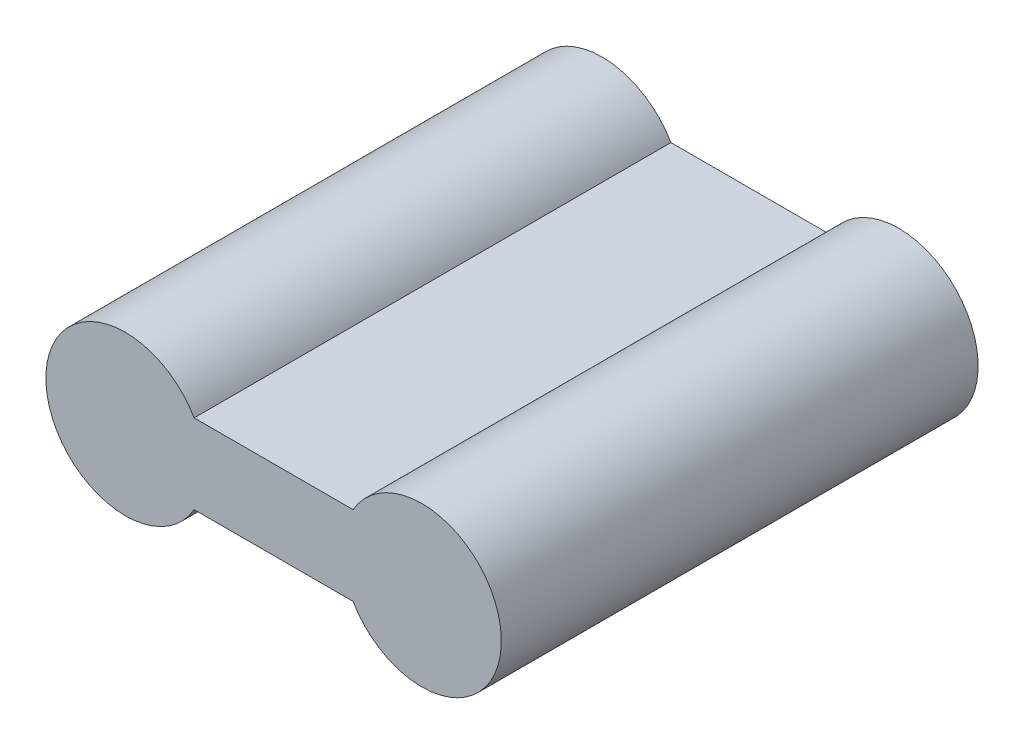
ISO-10303-21;
HEADER;
FILE_DESCRIPTION(('STEP AP214'),'2;1');
FILE_NAME('part.step','',(''),(''),'','','');
FILE_SCHEMA(('AUTOMOTIVE_DESIGN { 1 0 10303 214 1 1 1 1 }'));
ENDSEC;
DATA;
#1=APPLICATION_CONTEXT('core data for automotive mechanical design processes');
#2=APPLICATION_PROTOCOL_DEFINITION('international standard','automotive_design',2000,#1);
#3=PRODUCT_CONTEXT('',#1,'mechanical');
#4=PRODUCT('Part','Part','',(#3));
#5=PRODUCT_RELATED_PRODUCT_CATEGORY('part','',(#4));
#6=PRODUCT_DEFINITION_FORMATION('','',#4);
#7=PRODUCT_DEFINITION_CONTEXT('part definition',#1,'design');
#8=PRODUCT_DEFINITION('design','',#6,#7);
#9=PRODUCT_DEFINITION_SHAPE('','',#8);
#10=(LENGTH_UNIT() NAMED_UNIT(*) SI_UNIT(.MILLI.,.METRE.));
#11=(NAMED_UNIT(*) PLANE_ANGLE_UNIT() SI_UNIT($,.RADIAN.));
#12=(NAMED_UNIT(*) SI_UNIT($,.STERADIAN.) SOLID_ANGLE_UNIT());
#13=UNCERTAINTY_MEASURE_WITH_UNIT(LENGTH_MEASURE(1.E-05),#10,'distance_accuracy_value','');
#14=(GEOMETRIC_REPRESENTATION_CONTEXT(3) GLOBAL_UNCERTAINTY_ASSIGNED_CONTEXT((#13)) GLOBAL_UNIT_ASSIGNED_CONTEXT((#10,
#11,#12)) REPRESENTATION_CONTEXT('',''));
#15=CARTESIAN_POINT('',(0.,0.,0.));
#16=DIRECTION('',(0.,0.,1.));
#17=DIRECTION('',(1.,0.,0.));
#18=AXIS2_PLACEMENT_3D('',#15,#16,#17);
#19=CARTESIAN_POINT('',(3.73205080756888,1.,12.));
#20=DIRECTION('',(0.,0.,-1.));
#21=DIRECTION('',(-1.,0.,0.));
#22=AXIS2_PLACEMENT_3D('',#19,#20,#21);
#23=CYLINDRICAL_SURFACE('',#22,2.);
#24=CARTESIAN_POINT('',(3.73205080756888,1.,0.));
#25=DIRECTION('',(0.,0.,1.));
#26=DIRECTION('',(-1.,0.,0.));
#27=AXIS2_PLACEMENT_3D('',#24,#25,#26);
#28=CIRCLE('',#27,2.);
#29=CARTESIAN_POINT('',(2.,0.,0.));
#30=VERTEX_POINT('',#29);
#31=CARTESIAN_POINT('',(2.,2.,0.));
#32=VERTEX_POINT('',#31);
#33=EDGE_CURVE('E96',#30,#32,#28,.T.);
#34=ORIENTED_EDGE('',*,*,#33,.T.);
#35=DIRECTION('',(0.,0.,-1.));
#36=VECTOR('',#35,1.);
#37=CARTESIAN_POINT('',(2.,2.,12.));
#38=LINE('',#37,#36);
#39=CARTESIAN_POINT('',(2.,2.,12.));
#40=VERTEX_POINT('',#39);
#41=EDGE_CURVE('E11',#40,#32,#38,.T.);
#42=ORIENTED_EDGE('',*,*,#41,.F.);
#43=CARTESIAN_POINT('',(3.73205080756888,1.,12.));
#44=DIRECTION('',(0.,0.,1.));
#45=DIRECTION('',(-1.,0.,0.));
#46=AXIS2_PLACEMENT_3D('',#43,#44,#45);
#47=CIRCLE('',#46,2.);
#48=CARTESIAN_POINT('',(2.,0.,12.));
#49=VERTEX_POINT('',#48);
#50=EDGE_CURVE('E84',#49,#40,#47,.T.);
#51=ORIENTED_EDGE('',*,*,#50,.F.);
#52=DIRECTION('',(0.,0.,-1.));
#53=VECTOR('',#52,1.);
#54=CARTESIAN_POINT('',(2.,0.,12.));
#55=LINE('',#54,#53);
#56=EDGE_CURVE('E92',#49,#30,#55,.T.);
#57=ORIENTED_EDGE('',*,*,#56,.T.);
#58=EDGE_LOOP('',(#34,#42,#51,#57));
#59=FACE_BOUND('',#58,.T.);
#60=ADVANCED_FACE('F33',(#59),#23,.T.);
#61=CARTESIAN_POINT('',(-2.,2.,12.));
#62=DIRECTION('',(0.,-1.,0.));
#63=DIRECTION('',(0.,0.,-1.));
#64=AXIS2_PLACEMENT_3D('',#61,#62,#63);
#65=PLANE('',#64);
#66=DIRECTION('',(-1.,0.,0.));
#67=VECTOR('',#66,1.);
#68=CARTESIAN_POINT('',(-2.,2.,0.));
#69=LINE('',#68,#67);
#70=CARTESIAN_POINT('',(-2.,2.,0.));
#71=VERTEX_POINT('',#70);
#72=EDGE_CURVE('E88',#32,#71,#69,.T.);
#73=ORIENTED_EDGE('',*,*,#72,.T.);
#74=DIRECTION('',(0.,0.,-1.));
#75=VECTOR('',#74,1.);
#76=CARTESIAN_POINT('',(-2.,2.,12.));
#77=LINE('',#76,#75);
#78=CARTESIAN_POINT('',(-2.,2.,12.));
#79=VERTEX_POINT('',#78);
#80=EDGE_CURVE('E41',#79,#71,#77,.T.);
#81=ORIENTED_EDGE('',*,*,#80,.F.);
#82=DIRECTION('',(-1.,0.,0.));
#83=VECTOR('',#82,1.);
#84=CARTESIAN_POINT('',(-2.,2.,12.));
#85=LINE('',#84,#83);
#86=EDGE_CURVE('E79',#40,#79,#85,.T.);
#87=ORIENTED_EDGE('',*,*,#86,.F.);
#88=ORIENTED_EDGE('',*,*,#41,.T.);
#89=EDGE_LOOP('',(#73,#81,#87,#88));
#90=FACE_BOUND('',#89,.T.);
#91=ADVANCED_FACE('F87',(#90),#65,.F.);
#92=CARTESIAN_POINT('',(-3.73205080756888,1.,12.));
#93=DIRECTION('',(0.,0.,-1.));
#94=DIRECTION('',(-1.,0.,0.));
#95=AXIS2_PLACEMENT_3D('',#92,#93,#94);
#96=CYLINDRICAL_SURFACE('',#95,2.);
#97=CARTESIAN_POINT('',(-3.73205080756888,1.,0.));
#98=DIRECTION('',(0.,0.,1.));
#99=DIRECTION('',(1.,0.,0.));
#100=AXIS2_PLACEMENT_3D('',#97,#98,#99);
#101=CIRCLE('',#100,2.);
#102=CARTESIAN_POINT('',(-2.,0.,0.));
#103=VERTEX_POINT('',#102);
#104=EDGE_CURVE('E66',#71,#103,#101,.T.);
#105=ORIENTED_EDGE('',*,*,#104,.T.);
#106=DIRECTION('',(0.,0.,-1.));
#107=VECTOR('',#106,1.);
#108=CARTESIAN_POINT('',(-2.,0.,12.));
#109=LINE('',#108,#107);
#110=CARTESIAN_POINT('',(-2.,0.,12.));
#111=VERTEX_POINT('',#110);
#112=EDGE_CURVE('E89',#111,#103,#109,.T.);
#113=ORIENTED_EDGE('',*,*,#112,.F.);
#114=CARTESIAN_POINT('',(-3.73205080756888,1.,12.));
#115=DIRECTION('',(0.,0.,1.));
#116=DIRECTION('',(1.,0.,0.));
#117=AXIS2_PLACEMENT_3D('',#114,#115,#116);
#118=CIRCLE('',#117,2.);
#119=EDGE_CURVE('E82',#79,#111,#118,.T.);
#120=ORIENTED_EDGE('',*,*,#119,.F.);
#121=ORIENTED_EDGE('',*,*,#80,.T.);
#122=EDGE_LOOP('',(#105,#113,#120,#121));
#123=FACE_BOUND('',#122,.T.);
#124=ADVANCED_FACE('F90',(#123),#96,.T.);
#125=CARTESIAN_POINT('',(-2.,0.,12.));
#126=DIRECTION('',(0.,1.,0.));
#127=DIRECTION('',(-1.,0.,0.));
#128=AXIS2_PLACEMENT_3D('',#125,#126,#127);
#129=PLANE('',#128);
#130=DIRECTION('',(1.,0.,0.));
#131=VECTOR('',#130,1.);
#132=CARTESIAN_POINT('',(-2.,0.,0.));
#133=LINE('',#132,#131);
#134=EDGE_CURVE('E72',#103,#30,#133,.T.);
#135=ORIENTED_EDGE('',*,*,#134,.T.);
#136=ORIENTED_EDGE('',*,*,#56,.F.);
#137=DIRECTION('',(1.,0.,0.));
#138=VECTOR('',#137,1.);
#139=CARTESIAN_POINT('',(-2.,0.,12.));
#140=LINE('',#139,#138);
#141=EDGE_CURVE('E49',#111,#49,#140,.T.);
#142=ORIENTED_EDGE('',*,*,#141,.F.);
#143=ORIENTED_EDGE('',*,*,#112,.T.);
#144=EDGE_LOOP('',(#135,#136,#142,#143));
#145=FACE_BOUND('',#144,.T.);
#146=ADVANCED_FACE('F103',(#145),#129,.F.);
#147=CARTESIAN_POINT('',(3.73205080756888,1.,12.));
#148=DIRECTION('',(0.,0.,-1.));
#149=DIRECTION('',(-1.,0.,0.));
#150=AXIS2_PLACEMENT_3D('',#147,#148,#149);
#151=PLANE('',#150);
#152=ORIENTED_EDGE('',*,*,#50,.T.);
#153=ORIENTED_EDGE('',*,*,#86,.T.);
#154=ORIENTED_EDGE('',*,*,#119,.T.);
#155=ORIENTED_EDGE('',*,*,#141,.T.);
#156=EDGE_LOOP('',(#152,#153,#154,#155));
#157=FACE_BOUND('',#156,.T.);
#158=ADVANCED_FACE('F80',(#157),#151,.F.);
#159=CARTESIAN_POINT('',(3.73205080756888,1.,0.));
#160=DIRECTION('',(0.,0.,-1.));
#161=DIRECTION('',(-1.,0.,0.));
#162=AXIS2_PLACEMENT_3D('',#159,#160,#161);
#163=PLANE('',#162);
#164=ORIENTED_EDGE('',*,*,#33,.F.);
#165=ORIENTED_EDGE('',*,*,#134,.F.);
#166=ORIENTED_EDGE('',*,*,#104,.F.);
#167=ORIENTED_EDGE('',*,*,#72,.F.);
#168=EDGE_LOOP('',(#164,#165,#166,#167));
#169=FACE_BOUND('',#168,.T.);
#170=ADVANCED_FACE('F106',(#169),#163,.T.);
#171=CLOSED_SHELL('',(#60,#91,#124,#146,#158,#170));
#172=MANIFOLD_SOLID_BREP('B2',#171);
#173=ADVANCED_BREP_SHAPE_REPRESENTATION('',(#18,#172),#14);
#174=SHAPE_DEFINITION_REPRESENTATION(#9,#173);
ENDSEC;
END-ISO-10303-21;
